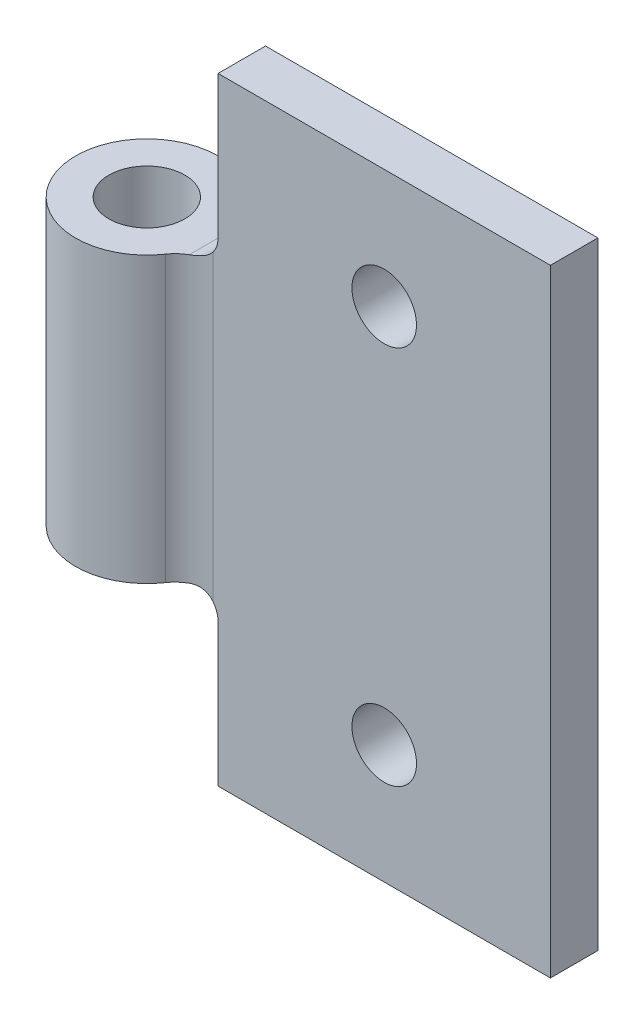
ISO-10303-21;
HEADER;
FILE_DESCRIPTION(('STEP AP214'),'2;1');
FILE_NAME('part.step','',(''),(''),'','','');
FILE_SCHEMA(('AUTOMOTIVE_DESIGN { 1 0 10303 214 1 1 1 1 }'));
ENDSEC;
DATA;
#1=APPLICATION_CONTEXT('core data for automotive mechanical design processes');
#2=APPLICATION_PROTOCOL_DEFINITION('international standard','automotive_design',2000,#1);
#3=PRODUCT_CONTEXT('',#1,'mechanical');
#4=PRODUCT('Part','Part','',(#3));
#5=PRODUCT_RELATED_PRODUCT_CATEGORY('part','',(#4));
#6=PRODUCT_DEFINITION_FORMATION('','',#4);
#7=PRODUCT_DEFINITION_CONTEXT('part definition',#1,'design');
#8=PRODUCT_DEFINITION('design','',#6,#7);
#9=PRODUCT_DEFINITION_SHAPE('','',#8);
#10=(LENGTH_UNIT() NAMED_UNIT(*) SI_UNIT(.MILLI.,.METRE.));
#11=(NAMED_UNIT(*) PLANE_ANGLE_UNIT() SI_UNIT($,.RADIAN.));
#12=(NAMED_UNIT(*) SI_UNIT($,.STERADIAN.) SOLID_ANGLE_UNIT());
#13=UNCERTAINTY_MEASURE_WITH_UNIT(LENGTH_MEASURE(1.E-05),#10,'distance_accuracy_value','');
#14=(GEOMETRIC_REPRESENTATION_CONTEXT(3) GLOBAL_UNCERTAINTY_ASSIGNED_CONTEXT((#13)) GLOBAL_UNIT_ASSIGNED_CONTEXT((#10,
#11,#12)) REPRESENTATION_CONTEXT('',''));
#15=CARTESIAN_POINT('',(0.,0.,0.));
#16=DIRECTION('',(0.,0.,1.));
#17=DIRECTION('',(1.,0.,0.));
#18=AXIS2_PLACEMENT_3D('',#15,#16,#17);
#19=CARTESIAN_POINT('',(-1.5875,31.7373,1.5875));
#20=DIRECTION('',(0.,0.,-1.));
#21=DIRECTION('',(-1.,0.,0.));
#22=AXIS2_PLACEMENT_3D('',#19,#20,#21);
#23=PLANE('',#22);
#24=CARTESIAN_POINT('',(11.1125,7.93749999999999,1.5875));
#25=DIRECTION('',(0.,0.,1.));
#26=DIRECTION('',(1.,0.,0.));
#27=AXIS2_PLACEMENT_3D('',#24,#25,#26);
#28=CIRCLE('',#27,2.15933928990634);
#29=CARTESIAN_POINT('',(13.2718392899063,7.93749999999999,1.5875));
#30=VERTEX_POINT('',#29);
#31=EDGE_CURVE('E268',#30,#30,#28,.T.);
#32=ORIENTED_EDGE('',*,*,#31,.F.);
#33=EDGE_LOOP('',(#32));
#34=FACE_BOUND('',#33,.T.);
#35=CARTESIAN_POINT('',(-1.5875,31.7373,1.5875));
#36=DIRECTION('',(0.,0.,-1.));
#37=DIRECTION('',(-1.,0.,0.));
#38=AXIS2_PLACEMENT_3D('',#35,#36,#37);
#39=CIRCLE('',#38,1.5875);
#40=CARTESIAN_POINT('',(0.,31.7373,1.5875));
#41=VERTEX_POINT('',#40);
#42=CARTESIAN_POINT('',(-0.32586105737924,30.7737526848863,1.5875));
#43=VERTEX_POINT('',#42);
#44=EDGE_CURVE('E278',#41,#43,#39,.T.);
#45=ORIENTED_EDGE('',*,*,#44,.T.);
#46=DIRECTION('',(0.,1.,0.));
#47=VECTOR('',#46,1.);
#48=CARTESIAN_POINT('',(-0.325861057379241,31.7373,1.5875));
#49=LINE('',#48,#47);
#50=CARTESIAN_POINT('',(-0.325861057379229,10.5012473151137,1.5875));
#51=VERTEX_POINT('',#50);
#52=EDGE_CURVE('E168',#43,#51,#49,.F.);
#53=ORIENTED_EDGE('',*,*,#52,.T.);
#54=CARTESIAN_POINT('',(-1.5875,9.5377,1.5875));
#55=DIRECTION('',(0.,0.,-1.));
#56=DIRECTION('',(-1.,0.,0.));
#57=AXIS2_PLACEMENT_3D('',#54,#55,#56);
#58=CIRCLE('',#57,1.5875);
#59=CARTESIAN_POINT('',(0.,9.53769999999999,1.5875));
#60=VERTEX_POINT('',#59);
#61=EDGE_CURVE('E142',#51,#60,#58,.T.);
#62=ORIENTED_EDGE('',*,*,#61,.T.);
#63=DIRECTION('',(0.,-1.,0.));
#64=VECTOR('',#63,1.);
#65=CARTESIAN_POINT('',(0.,9.53769999999999,1.5875));
#66=LINE('',#65,#64);
#67=CARTESIAN_POINT('',(0.,0.,1.5875));
#68=VERTEX_POINT('',#67);
#69=EDGE_CURVE('E135',#60,#68,#66,.T.);
#70=ORIENTED_EDGE('',*,*,#69,.T.);
#71=DIRECTION('',(1.,0.,0.));
#72=VECTOR('',#71,1.);
#73=CARTESIAN_POINT('',(0.,0.,1.5875));
#74=LINE('',#73,#72);
#75=CARTESIAN_POINT('',(22.225,0.,1.5875));
#76=VERTEX_POINT('',#75);
#77=EDGE_CURVE('E124',#68,#76,#74,.T.);
#78=ORIENTED_EDGE('',*,*,#77,.T.);
#79=DIRECTION('',(0.,1.,0.));
#80=VECTOR('',#79,1.);
#81=CARTESIAN_POINT('',(22.225,0.,1.5875));
#82=LINE('',#81,#80);
#83=CARTESIAN_POINT('',(22.225,41.275,1.5875));
#84=VERTEX_POINT('',#83);
#85=EDGE_CURVE('E134',#76,#84,#82,.T.);
#86=ORIENTED_EDGE('',*,*,#85,.T.);
#87=DIRECTION('',(-1.,0.,0.));
#88=VECTOR('',#87,1.);
#89=CARTESIAN_POINT('',(22.225,41.275,1.5875));
#90=LINE('',#89,#88);
#91=CARTESIAN_POINT('',(0.,41.275,1.5875));
#92=VERTEX_POINT('',#91);
#93=EDGE_CURVE('E274',#84,#92,#90,.T.);
#94=ORIENTED_EDGE('',*,*,#93,.T.);
#95=DIRECTION('',(0.,-1.,0.));
#96=VECTOR('',#95,1.);
#97=CARTESIAN_POINT('',(0.,41.275,1.5875));
#98=LINE('',#97,#96);
#99=EDGE_CURVE('E276',#92,#41,#98,.T.);
#100=ORIENTED_EDGE('',*,*,#99,.T.);
#101=EDGE_LOOP('',(#45,#53,#62,#70,#78,#86,#94,#100));
#102=FACE_BOUND('',#101,.T.);
#103=CARTESIAN_POINT('',(11.1125,33.3375,1.5875));
#104=DIRECTION('',(0.,0.,1.));
#105=DIRECTION('',(-1.,0.,0.));
#106=AXIS2_PLACEMENT_3D('',#103,#104,#105);
#107=CIRCLE('',#106,2.15933928990635);
#108=CARTESIAN_POINT('',(8.95316071009365,33.3375,1.5875));
#109=VERTEX_POINT('',#108);
#110=EDGE_CURVE('E262',#109,#109,#107,.T.);
#111=ORIENTED_EDGE('',*,*,#110,.F.);
#112=EDGE_LOOP('',(#111));
#113=FACE_BOUND('',#112,.T.);
#114=ADVANCED_FACE('F31',(#34,#102,#113),#23,.F.);
#115=CARTESIAN_POINT('',(-1.5875,31.7373,-1.5875));
#116=DIRECTION('',(0.,0.,-1.));
#117=DIRECTION('',(-1.,0.,0.));
#118=AXIS2_PLACEMENT_3D('',#115,#116,#117);
#119=PLANE('',#118);
#120=CARTESIAN_POINT('',(-1.5875,9.5377,-1.5875));
#121=DIRECTION('',(0.,0.,-1.));
#122=DIRECTION('',(-1.,0.,0.));
#123=AXIS2_PLACEMENT_3D('',#120,#121,#122);
#124=CIRCLE('',#123,1.5875);
#125=CARTESIAN_POINT('',(-0.325861057379229,10.5012473151137,-1.5875));
#126=VERTEX_POINT('',#125);
#127=CARTESIAN_POINT('',(0.,9.53769999999999,-1.5875));
#128=VERTEX_POINT('',#127);
#129=EDGE_CURVE('E146',#126,#128,#124,.T.);
#130=ORIENTED_EDGE('',*,*,#129,.F.);
#131=DIRECTION('',(0.,-1.,0.));
#132=VECTOR('',#131,1.);
#133=CARTESIAN_POINT('',(-0.32586105737924,30.1498,-1.5875));
#134=LINE('',#133,#132);
#135=CARTESIAN_POINT('',(-0.32586105737924,30.7737526848863,-1.5875));
#136=VERTEX_POINT('',#135);
#137=EDGE_CURVE('E166',#126,#136,#134,.F.);
#138=ORIENTED_EDGE('',*,*,#137,.T.);
#139=CARTESIAN_POINT('',(-1.5875,31.7373,-1.5875));
#140=DIRECTION('',(0.,0.,-1.));
#141=DIRECTION('',(-1.,0.,0.));
#142=AXIS2_PLACEMENT_3D('',#139,#140,#141);
#143=CIRCLE('',#142,1.5875);
#144=CARTESIAN_POINT('',(0.,31.7373,-1.5875));
#145=VERTEX_POINT('',#144);
#146=EDGE_CURVE('E291',#145,#136,#143,.T.);
#147=ORIENTED_EDGE('',*,*,#146,.F.);
#148=DIRECTION('',(0.,-1.,0.));
#149=VECTOR('',#148,1.);
#150=CARTESIAN_POINT('',(0.,41.275,-1.5875));
#151=LINE('',#150,#149);
#152=CARTESIAN_POINT('',(0.,41.275,-1.5875));
#153=VERTEX_POINT('',#152);
#154=EDGE_CURVE('E289',#153,#145,#151,.T.);
#155=ORIENTED_EDGE('',*,*,#154,.F.);
#156=DIRECTION('',(-1.,0.,0.));
#157=VECTOR('',#156,1.);
#158=CARTESIAN_POINT('',(22.225,41.275,-1.5875));
#159=LINE('',#158,#157);
#160=CARTESIAN_POINT('',(22.225,41.275,-1.5875));
#161=VERTEX_POINT('',#160);
#162=EDGE_CURVE('E287',#161,#153,#159,.T.);
#163=ORIENTED_EDGE('',*,*,#162,.F.);
#164=DIRECTION('',(0.,1.,0.));
#165=VECTOR('',#164,1.);
#166=CARTESIAN_POINT('',(22.225,0.,-1.5875));
#167=LINE('',#166,#165);
#168=CARTESIAN_POINT('',(22.225,0.,-1.5875));
#169=VERTEX_POINT('',#168);
#170=EDGE_CURVE('E285',#169,#161,#167,.T.);
#171=ORIENTED_EDGE('',*,*,#170,.F.);
#172=DIRECTION('',(1.,0.,0.));
#173=VECTOR('',#172,1.);
#174=CARTESIAN_POINT('',(0.,0.,-1.5875));
#175=LINE('',#174,#173);
#176=CARTESIAN_POINT('',(0.,0.,-1.5875));
#177=VERTEX_POINT('',#176);
#178=EDGE_CURVE('E283',#177,#169,#175,.T.);
#179=ORIENTED_EDGE('',*,*,#178,.F.);
#180=DIRECTION('',(0.,-1.,0.));
#181=VECTOR('',#180,1.);
#182=CARTESIAN_POINT('',(0.,9.53769999999999,-1.5875));
#183=LINE('',#182,#181);
#184=EDGE_CURVE('E150',#128,#177,#183,.T.);
#185=ORIENTED_EDGE('',*,*,#184,.F.);
#186=EDGE_LOOP('',(#130,#138,#147,#155,#163,#171,#179,#185));
#187=FACE_BOUND('',#186,.T.);
#188=CARTESIAN_POINT('',(11.1125,7.93749999999999,-1.5875));
#189=DIRECTION('',(0.,0.,1.));
#190=DIRECTION('',(1.,0.,0.));
#191=AXIS2_PLACEMENT_3D('',#188,#189,#190);
#192=CIRCLE('',#191,2.15933928990634);
#193=CARTESIAN_POINT('',(13.2718392899063,7.93749999999999,-1.5875));
#194=VERTEX_POINT('',#193);
#195=EDGE_CURVE('E265',#194,#194,#192,.T.);
#196=ORIENTED_EDGE('',*,*,#195,.T.);
#197=EDGE_LOOP('',(#196));
#198=FACE_BOUND('',#197,.T.);
#199=CARTESIAN_POINT('',(11.1125,33.3375,-1.5875));
#200=DIRECTION('',(0.,0.,1.));
#201=DIRECTION('',(-1.,0.,0.));
#202=AXIS2_PLACEMENT_3D('',#199,#200,#201);
#203=CIRCLE('',#202,2.15933928990635);
#204=CARTESIAN_POINT('',(8.95316071009365,33.3375,-1.5875));
#205=VERTEX_POINT('',#204);
#206=EDGE_CURVE('E259',#205,#205,#203,.T.);
#207=ORIENTED_EDGE('',*,*,#206,.T.);
#208=EDGE_LOOP('',(#207));
#209=FACE_BOUND('',#208,.T.);
#210=ADVANCED_FACE('F196',(#187,#198,#209),#119,.T.);
#211=CARTESIAN_POINT('',(0.,9.53769999999999,1.5875));
#212=DIRECTION('',(1.,0.,0.));
#213=DIRECTION('',(0.,1.,0.));
#214=AXIS2_PLACEMENT_3D('',#211,#212,#213);
#215=PLANE('',#214);
#216=ORIENTED_EDGE('',*,*,#184,.T.);
#217=DIRECTION('',(0.,0.,-1.));
#218=VECTOR('',#217,1.);
#219=CARTESIAN_POINT('',(0.,0.,1.5875));
#220=LINE('',#219,#218);
#221=EDGE_CURVE('E128',#68,#177,#220,.T.);
#222=ORIENTED_EDGE('',*,*,#221,.F.);
#223=ORIENTED_EDGE('',*,*,#69,.F.);
#224=DIRECTION('',(0.,0.,-1.));
#225=VECTOR('',#224,1.);
#226=CARTESIAN_POINT('',(0.,9.53769999999999,1.5875));
#227=LINE('',#226,#225);
#228=EDGE_CURVE('E281',#60,#128,#227,.T.);
#229=ORIENTED_EDGE('',*,*,#228,.T.);
#230=EDGE_LOOP('',(#216,#222,#223,#229));
#231=FACE_BOUND('',#230,.T.);
#232=ADVANCED_FACE('F148',(#231),#215,.F.);
#233=CARTESIAN_POINT('',(0.,0.,1.5875));
#234=DIRECTION('',(0.,1.,0.));
#235=DIRECTION('',(0.,0.,1.));
#236=AXIS2_PLACEMENT_3D('',#233,#234,#235);
#237=PLANE('',#236);
#238=ORIENTED_EDGE('',*,*,#178,.T.);
#239=DIRECTION('',(0.,0.,-1.));
#240=VECTOR('',#239,1.);
#241=CARTESIAN_POINT('',(22.225,0.,1.5875));
#242=LINE('',#241,#240);
#243=EDGE_CURVE('E131',#76,#169,#242,.T.);
#244=ORIENTED_EDGE('',*,*,#243,.F.);
#245=ORIENTED_EDGE('',*,*,#77,.F.);
#246=ORIENTED_EDGE('',*,*,#221,.T.);
#247=EDGE_LOOP('',(#238,#244,#245,#246));
#248=FACE_BOUND('',#247,.T.);
#249=ADVANCED_FACE('F126',(#248),#237,.F.);
#250=CARTESIAN_POINT('',(22.225,0.,1.5875));
#251=DIRECTION('',(-1.,0.,0.));
#252=DIRECTION('',(0.,0.,1.));
#253=AXIS2_PLACEMENT_3D('',#250,#251,#252);
#254=PLANE('',#253);
#255=ORIENTED_EDGE('',*,*,#170,.T.);
#256=DIRECTION('',(0.,0.,-1.));
#257=VECTOR('',#256,1.);
#258=CARTESIAN_POINT('',(22.225,41.275,1.5875));
#259=LINE('',#258,#257);
#260=EDGE_CURVE('E155',#84,#161,#259,.T.);
#261=ORIENTED_EDGE('',*,*,#260,.F.);
#262=ORIENTED_EDGE('',*,*,#85,.F.);
#263=ORIENTED_EDGE('',*,*,#243,.T.);
#264=EDGE_LOOP('',(#255,#261,#262,#263));
#265=FACE_BOUND('',#264,.T.);
#266=ADVANCED_FACE('F199',(#265),#254,.F.);
#267=CARTESIAN_POINT('',(22.225,41.275,1.5875));
#268=DIRECTION('',(0.,-1.,0.));
#269=DIRECTION('',(0.,0.,-1.));
#270=AXIS2_PLACEMENT_3D('',#267,#268,#269);
#271=PLANE('',#270);
#272=ORIENTED_EDGE('',*,*,#162,.T.);
#273=DIRECTION('',(0.,0.,-1.));
#274=VECTOR('',#273,1.);
#275=CARTESIAN_POINT('',(0.,41.275,1.5875));
#276=LINE('',#275,#274);
#277=EDGE_CURVE('E301',#92,#153,#276,.T.);
#278=ORIENTED_EDGE('',*,*,#277,.F.);
#279=ORIENTED_EDGE('',*,*,#93,.F.);
#280=ORIENTED_EDGE('',*,*,#260,.T.);
#281=EDGE_LOOP('',(#272,#278,#279,#280));
#282=FACE_BOUND('',#281,.T.);
#283=ADVANCED_FACE('F202',(#282),#271,.F.);
#284=CARTESIAN_POINT('',(0.,41.275,1.5875));
#285=DIRECTION('',(1.,0.,0.));
#286=DIRECTION('',(0.,1.,0.));
#287=AXIS2_PLACEMENT_3D('',#284,#285,#286);
#288=PLANE('',#287);
#289=ORIENTED_EDGE('',*,*,#154,.T.);
#290=DIRECTION('',(0.,0.,-1.));
#291=VECTOR('',#290,1.);
#292=CARTESIAN_POINT('',(0.,31.7373,1.5875));
#293=LINE('',#292,#291);
#294=EDGE_CURVE('E298',#41,#145,#293,.T.);
#295=ORIENTED_EDGE('',*,*,#294,.F.);
#296=ORIENTED_EDGE('',*,*,#99,.F.);
#297=ORIENTED_EDGE('',*,*,#277,.T.);
#298=EDGE_LOOP('',(#289,#295,#296,#297));
#299=FACE_BOUND('',#298,.T.);
#300=ADVANCED_FACE('F206',(#299),#288,.F.);
#301=CARTESIAN_POINT('',(-1.5875,31.7373,1.5875));
#302=DIRECTION('',(0.,0.,-1.));
#303=DIRECTION('',(-1.,0.,0.));
#304=AXIS2_PLACEMENT_3D('',#301,#302,#303);
#305=CYLINDRICAL_SURFACE('',#304,1.5875);
#306=ORIENTED_EDGE('',*,*,#146,.T.);
#307=CARTESIAN_POINT('',(-0.325861057379241,30.7737526848863,-1.5875));
#308=CARTESIAN_POINT('',(-0.350852440017176,30.7410299920205,-1.58750178097361));
#309=CARTESIAN_POINT('',(-0.377108387179057,30.7092925959823,-1.5878693737098));
#310=CARTESIAN_POINT('',(-0.431998667374947,30.6479563295817,-1.58956920495339));
#311=CARTESIAN_POINT('',(-0.460633767447448,30.6183581546997,-1.59090175563976));
#312=CARTESIAN_POINT('',(-0.549675686639572,30.5332277856428,-1.59668465251699));
#313=CARTESIAN_POINT('',(-0.613372628119726,30.4811592195779,-1.60291745062643));
#314=CARTESIAN_POINT('',(-0.747618139180753,30.3876787706459,-1.62184020657373));
#315=CARTESIAN_POINT('',(-0.818190543330004,30.3463059166726,-1.63455332361175));
#316=CARTESIAN_POINT('',(-0.963412892616888,30.2753883684632,-1.66769307821942));
#317=CARTESIAN_POINT('',(-1.03806248911955,30.2458426646981,-1.68811905715361));
#318=CARTESIAN_POINT('',(-1.15310297378553,30.2098120625143,-1.7256151363827));
#319=CARTESIAN_POINT('',(-1.19316334628244,30.1990076746284,-1.73977601805001));
#320=CARTESIAN_POINT('',(-1.27318987264885,30.180686068671,-1.77038320978471));
#321=CARTESIAN_POINT('',(-1.31315599149589,30.1731699247268,-1.78683026433755));
#322=CARTESIAN_POINT('',(-1.39272187119098,30.1612788928829,-1.82200527657274));
#323=CARTESIAN_POINT('',(-1.43231967663216,30.1569159840368,-1.84074161952391));
#324=CARTESIAN_POINT('',(-1.51064024643991,30.1511745177515,-1.88031646527296));
#325=CARTESIAN_POINT('',(-1.54936359522852,30.1497939050159,-1.90115350996693));
#326=CARTESIAN_POINT('',(-1.58750000000002,30.1498,-1.92298935623737));
#327=B_SPLINE_CURVE_WITH_KNOTS('',3,(#307,#308,#309,#310,#311,#312,#313,#314,#315,#316,#317,
#318,#319,#320,#321,#322,#323,#324,#325,#326),.UNSPECIFIED.,.F.,.F.,(4,2,2,2,2,2,2,2,2,4),(0.,
0.123457388743192,0.246954735735409,0.493200867995164,0.740333263682594,0.987444560410513,
1.11881390880805,1.25022613790859,1.38213501121677,1.51395294840416),.UNSPECIFIED.);
#328=CARTESIAN_POINT('',(-1.58750000000001,30.1498,-1.92298935623737));
#329=VERTEX_POINT('',#328);
#330=EDGE_CURVE('E178',#136,#329,#327,.T.);
#331=ORIENTED_EDGE('',*,*,#330,.T.);
#332=DIRECTION('',(0.,0.,-1.));
#333=VECTOR('',#332,1.);
#334=CARTESIAN_POINT('',(-1.58750000000001,30.1498,1.5875));
#335=LINE('',#334,#333);
#336=CARTESIAN_POINT('',(-1.58750000000001,30.1498,1.92298935623737));
#337=VERTEX_POINT('',#336);
#338=EDGE_CURVE('E50',#337,#329,#335,.T.);
#339=ORIENTED_EDGE('',*,*,#338,.F.);
#340=CARTESIAN_POINT('',(-1.58750000000001,30.1498,1.92298935623737));
#341=CARTESIAN_POINT('',(-1.55183917808619,30.1497954996679,1.90257289202669));
#342=CARTESIAN_POINT('',(-1.51566755963559,30.1510018260378,1.88302854207427));
#343=CARTESIAN_POINT('',(-1.44254602660921,30.15600782002,1.84577028222349));
#344=CARTESIAN_POINT('',(-1.40559570065709,30.1598088934504,1.82805737058035));
#345=CARTESIAN_POINT('',(-1.33130511220348,30.1701616980659,1.79461817983449));
#346=CARTESIAN_POINT('',(-1.29396625799876,30.1767055735546,1.7788863926009));
#347=CARTESIAN_POINT('',(-1.21913328979423,30.1926548559138,1.74941560030578));
#348=CARTESIAN_POINT('',(-1.18163921018646,30.2020596592146,1.73567617581764));
#349=CARTESIAN_POINT('',(-1.06908623821788,30.2348006811002,1.69737972663789));
#350=CARTESIAN_POINT('',(-0.994223183455657,30.2626285377657,1.67586305845062));
#351=CARTESIAN_POINT('',(-0.848107205228998,30.3301982741445,1.6406298850201));
#352=CARTESIAN_POINT('',(-0.776855387401982,30.3699437771811,1.62691575566288));
#353=CARTESIAN_POINT('',(-0.672499340743414,30.4392850103991,1.61099408803753));
#354=CARTESIAN_POINT('',(-0.637091698832155,30.4649789858267,1.60640261103605));
#355=CARTESIAN_POINT('',(-0.568396665010468,30.5193100067734,1.59887037248937));
#356=CARTESIAN_POINT('',(-0.535109798159898,30.5479477765638,1.59593001833082));
#357=CARTESIAN_POINT('',(-0.470886933589179,30.6080211964205,1.59143843293007));
#358=CARTESIAN_POINT('',(-0.439958161921401,30.6394648523648,1.58989132591193));
#359=CARTESIAN_POINT('',(-0.380816979219808,30.7048181971085,1.58792233882378));
#360=CARTESIAN_POINT('',(-0.352603325562836,30.7387267452118,1.58749994162649));
#361=CARTESIAN_POINT('',(-0.325861057379241,30.7737526848863,1.5875));
#362=B_SPLINE_CURVE_WITH_KNOTS('',3,(#340,#341,#342,#343,#344,#345,#346,#347,#348,#349,#350,
#351,#352,#353,#354,#355,#356,#357,#358,#359,#360,#361),.UNSPECIFIED.,.F.,.F.,(4,2,2,2,2,2,2,2,
2,2,4),(0.,0.123259278640648,0.246585391454469,0.369560672210149,0.492510026854425,
0.73927835591012,0.986121786171151,1.11793090541479,1.249772532056,1.3820031592715,
1.51417297802032),.UNSPECIFIED.);
#363=EDGE_CURVE('E11',#337,#43,#362,.T.);
#364=ORIENTED_EDGE('',*,*,#363,.T.);
#365=ORIENTED_EDGE('',*,*,#44,.F.);
#366=ORIENTED_EDGE('',*,*,#294,.T.);
#367=EDGE_LOOP('',(#306,#331,#339,#364,#365,#366));
#368=FACE_BOUND('',#367,.T.);
#369=ADVANCED_FACE('F209',(#368),#305,.F.);
#370=CARTESIAN_POINT('',(-1.58750000000001,30.1498,1.5875));
#371=DIRECTION('',(0.,-1.,0.));
#372=DIRECTION('',(1.,0.,0.));
#373=AXIS2_PLACEMENT_3D('',#370,#371,#372);
#374=PLANE('',#373);
#375=CARTESIAN_POINT('',(-6.35000000000001,30.1498,0.));
#376=DIRECTION('',(0.,1.,0.));
#377=DIRECTION('',(-1.,0.,0.));
#378=AXIS2_PLACEMENT_3D('',#375,#376,#377);
#379=CIRCLE('',#378,2.54);
#380=CARTESIAN_POINT('',(-8.89000000000001,30.1498,0.));
#381=VERTEX_POINT('',#380);
#382=EDGE_CURVE('E162',#381,#381,#379,.T.);
#383=ORIENTED_EDGE('',*,*,#382,.F.);
#384=EDGE_LOOP('',(#383));
#385=FACE_BOUND('',#384,.T.);
#386=ORIENTED_EDGE('',*,*,#338,.T.);
#387=CARTESIAN_POINT('',(-0.32586105737924,30.1498,-4.1275));
#388=DIRECTION('',(0.,-1.,0.));
#389=DIRECTION('',(1.,0.,0.));
#390=AXIS2_PLACEMENT_3D('',#387,#388,#389);
#391=CIRCLE('',#390,2.54);
#392=CARTESIAN_POINT('',(-2.42121373307342,30.1498,-2.69184782608695));
#393=VERTEX_POINT('',#392);
#394=EDGE_CURVE('E325',#329,#393,#391,.T.);
#395=ORIENTED_EDGE('',*,*,#394,.T.);
#396=CARTESIAN_POINT('',(-6.35000000000001,30.1498,0.));
#397=DIRECTION('',(0.,1.,0.));
#398=DIRECTION('',(-1.,0.,0.));
#399=AXIS2_PLACEMENT_3D('',#396,#397,#398);
#400=CIRCLE('',#399,4.7625);
#401=CARTESIAN_POINT('',(-2.42121373307342,30.1498,2.69184782608695));
#402=VERTEX_POINT('',#401);
#403=EDGE_CURVE('E161',#393,#402,#400,.T.);
#404=ORIENTED_EDGE('',*,*,#403,.T.);
#405=CARTESIAN_POINT('',(-0.32586105737924,30.1498,4.1275));
#406=DIRECTION('',(0.,-1.,0.));
#407=DIRECTION('',(1.,0.,0.));
#408=AXIS2_PLACEMENT_3D('',#405,#406,#407);
#409=CIRCLE('',#408,2.54);
#410=EDGE_CURVE('E44',#402,#337,#409,.T.);
#411=ORIENTED_EDGE('',*,*,#410,.T.);
#412=EDGE_LOOP('',(#386,#395,#404,#411));
#413=FACE_BOUND('',#412,.T.);
#414=ADVANCED_FACE('F214',(#385,#413),#374,.F.);
#415=CARTESIAN_POINT('',(-6.35,11.1252,1.5875));
#416=DIRECTION('',(0.,1.,0.));
#417=DIRECTION('',(0.,0.,1.));
#418=AXIS2_PLACEMENT_3D('',#415,#416,#417);
#419=PLANE('',#418);
#420=CARTESIAN_POINT('',(-6.35,11.1252,0.));
#421=DIRECTION('',(0.,1.,0.));
#422=DIRECTION('',(0.,0.,1.));
#423=AXIS2_PLACEMENT_3D('',#420,#421,#422);
#424=CIRCLE('',#423,2.54);
#425=CARTESIAN_POINT('',(-6.35,11.1252,2.54));
#426=VERTEX_POINT('',#425);
#427=EDGE_CURVE('E159',#426,#426,#424,.T.);
#428=ORIENTED_EDGE('',*,*,#427,.T.);
#429=EDGE_LOOP('',(#428));
#430=FACE_BOUND('',#429,.T.);
#431=DIRECTION('',(0.,0.,-1.));
#432=VECTOR('',#431,1.);
#433=CARTESIAN_POINT('',(-1.58750000000001,11.1252,1.5875));
#434=LINE('',#433,#432);
#435=CARTESIAN_POINT('',(-1.58750000000001,11.1252,1.92298935623737));
#436=VERTEX_POINT('',#435);
#437=CARTESIAN_POINT('',(-1.58750000000001,11.1252,-1.92298935623737));
#438=VERTEX_POINT('',#437);
#439=EDGE_CURVE('E58',#436,#438,#434,.T.);
#440=ORIENTED_EDGE('',*,*,#439,.F.);
#441=CARTESIAN_POINT('',(-0.32586105737923,11.1252,4.1275));
#442=DIRECTION('',(0.,1.,0.));
#443=DIRECTION('',(0.,0.,1.));
#444=AXIS2_PLACEMENT_3D('',#441,#442,#443);
#445=CIRCLE('',#444,2.54);
#446=CARTESIAN_POINT('',(-2.42121373307341,11.1252,2.69184782608696));
#447=VERTEX_POINT('',#446);
#448=EDGE_CURVE('E324',#436,#447,#445,.T.);
#449=ORIENTED_EDGE('',*,*,#448,.T.);
#450=CARTESIAN_POINT('',(-6.35,11.1252,0.));
#451=DIRECTION('',(0.,1.,0.));
#452=DIRECTION('',(-1.,0.,0.));
#453=AXIS2_PLACEMENT_3D('',#450,#451,#452);
#454=CIRCLE('',#453,4.7625);
#455=CARTESIAN_POINT('',(-2.42121373307341,11.1252,-2.69184782608696));
#456=VERTEX_POINT('',#455);
#457=EDGE_CURVE('E256',#456,#447,#454,.T.);
#458=ORIENTED_EDGE('',*,*,#457,.F.);
#459=CARTESIAN_POINT('',(-0.32586105737923,11.1252,-4.1275));
#460=DIRECTION('',(0.,1.,0.));
#461=DIRECTION('',(0.,0.,1.));
#462=AXIS2_PLACEMENT_3D('',#459,#460,#461);
#463=CIRCLE('',#462,2.54);
#464=EDGE_CURVE('E170',#456,#438,#463,.T.);
#465=ORIENTED_EDGE('',*,*,#464,.T.);
#466=EDGE_LOOP('',(#440,#449,#458,#465));
#467=FACE_BOUND('',#466,.T.);
#468=ADVANCED_FACE('F217',(#430,#467),#419,.F.);
#469=CARTESIAN_POINT('',(-1.5875,9.5377,1.5875));
#470=DIRECTION('',(0.,0.,-1.));
#471=DIRECTION('',(-1.,0.,0.));
#472=AXIS2_PLACEMENT_3D('',#469,#470,#471);
#473=CYLINDRICAL_SURFACE('',#472,1.5875);
#474=ORIENTED_EDGE('',*,*,#439,.T.);
#475=CARTESIAN_POINT('',(-1.58750000000001,11.1252,-1.92298935623737));
#476=CARTESIAN_POINT('',(-1.55183917808618,11.1252045003321,-1.90257289202669));
#477=CARTESIAN_POINT('',(-1.51566755963558,11.1239981739622,-1.88302854207427));
#478=CARTESIAN_POINT('',(-1.44254602660921,11.11899217998,-1.8457702822235));
#479=CARTESIAN_POINT('',(-1.40559570065709,11.1151911065496,-1.82805737058035));
#480=CARTESIAN_POINT('',(-1.33130511220347,11.1048383019341,-1.79461817983449));
#481=CARTESIAN_POINT('',(-1.29396625799876,11.0982944264454,-1.7788863926009));
#482=CARTESIAN_POINT('',(-1.21913328979423,11.0823451440862,-1.74941560030578));
#483=CARTESIAN_POINT('',(-1.18163921018646,11.0729403407854,-1.73567617581764));
#484=CARTESIAN_POINT('',(-1.06908623821788,11.0401993188997,-1.69737972663789));
#485=CARTESIAN_POINT('',(-0.994223183455655,11.0123714622343,-1.67586305845063));
#486=CARTESIAN_POINT('',(-0.848107205228994,10.9448017258555,-1.6406298850201));
#487=CARTESIAN_POINT('',(-0.776855387401979,10.9050562228189,-1.62691575566288));
#488=CARTESIAN_POINT('',(-0.67249934074341,10.8357149896009,-1.61099408803753));
#489=CARTESIAN_POINT('',(-0.63709169883215,10.8100210141733,-1.60640261103605));
#490=CARTESIAN_POINT('',(-0.568396665010461,10.7556899932266,-1.59887037248937));
#491=CARTESIAN_POINT('',(-0.535109798159891,10.7270522234362,-1.59593001833082));
#492=CARTESIAN_POINT('',(-0.47088693358917,10.6669788035795,-1.59143843293007));
#493=CARTESIAN_POINT('',(-0.439958161921392,10.6355351476352,-1.58989132591193));
#494=CARTESIAN_POINT('',(-0.380816979219797,10.5701818028915,-1.58792233882378));
#495=CARTESIAN_POINT('',(-0.352603325562825,10.5362732547882,-1.58749994162649));
#496=CARTESIAN_POINT('',(-0.325861057379229,10.5012473151137,-1.5875));
#497=B_SPLINE_CURVE_WITH_KNOTS('',3,(#475,#476,#477,#478,#479,#480,#481,#482,#483,#484,#485,
#486,#487,#488,#489,#490,#491,#492,#493,#494,#495,#496),.UNSPECIFIED.,.F.,.F.,(4,2,2,2,2,2,2,2,
2,2,4),(0.,0.123259278640649,0.24658539145447,0.36956067221015,0.492510026854425,
0.739278355910121,0.986121786171152,1.11793090541479,1.24977253205601,1.38200315927151,
1.51417297802033),.UNSPECIFIED.);
#498=EDGE_CURVE('E172',#438,#126,#497,.T.);
#499=ORIENTED_EDGE('',*,*,#498,.T.);
#500=ORIENTED_EDGE('',*,*,#129,.T.);
#501=ORIENTED_EDGE('',*,*,#228,.F.);
#502=ORIENTED_EDGE('',*,*,#61,.F.);
#503=CARTESIAN_POINT('',(-0.32586105737923,10.5012473151137,1.5875));
#504=CARTESIAN_POINT('',(-0.350852440017164,10.5339700079795,1.58750178097361));
#505=CARTESIAN_POINT('',(-0.377108387179046,10.5657074040177,1.5878693737098));
#506=CARTESIAN_POINT('',(-0.431998667374936,10.6270436704183,1.58956920495339));
#507=CARTESIAN_POINT('',(-0.460633767447437,10.6566418453003,1.59090175563976));
#508=CARTESIAN_POINT('',(-0.54967568663956,10.7417722143572,1.59668465251699));
#509=CARTESIAN_POINT('',(-0.613372628119713,10.7938407804221,1.60291745062643));
#510=CARTESIAN_POINT('',(-0.74761813918074,10.8873212293541,1.62184020657373));
#511=CARTESIAN_POINT('',(-0.818190543329991,10.9286940833274,1.63455332361175));
#512=CARTESIAN_POINT('',(-0.963412892616872,10.9996116315368,1.66769307821942));
#513=CARTESIAN_POINT('',(-1.03806248911953,11.0291573353018,1.6881190571536));
#514=CARTESIAN_POINT('',(-1.15310297378552,11.0651879374857,1.7256151363827));
#515=CARTESIAN_POINT('',(-1.19316334628242,11.0759923253716,1.73977601805001));
#516=CARTESIAN_POINT('',(-1.27318987264884,11.094313931329,1.77038320978471));
#517=CARTESIAN_POINT('',(-1.31315599149588,11.1018300752732,1.78683026433755));
#518=CARTESIAN_POINT('',(-1.39272187119097,11.1137211071171,1.82200527657275));
#519=CARTESIAN_POINT('',(-1.43231967663215,11.1180840159631,1.84074161952391));
#520=CARTESIAN_POINT('',(-1.51064024643991,11.1238254822485,1.88031646527297));
#521=CARTESIAN_POINT('',(-1.54936359522851,11.1252060949841,1.90115350996694));
#522=CARTESIAN_POINT('',(-1.58750000000001,11.1252,1.92298935623737));
#523=B_SPLINE_CURVE_WITH_KNOTS('',3,(#503,#504,#505,#506,#507,#508,#509,#510,#511,#512,#513,
#514,#515,#516,#517,#518,#519,#520,#521,#522),.UNSPECIFIED.,.F.,.F.,(4,2,2,2,2,2,2,2,2,4),(0.,
0.123457388743194,0.24695473573541,0.493200867995164,0.740333263682594,0.987444560410511,
1.11881390880805,1.2502261379086,1.38213501121678,1.51395294840417),.UNSPECIFIED.);
#524=EDGE_CURVE('E322',#51,#436,#523,.T.);
#525=ORIENTED_EDGE('',*,*,#524,.T.);
#526=EDGE_LOOP('',(#474,#499,#500,#501,#502,#525));
#527=FACE_BOUND('',#526,.T.);
#528=ADVANCED_FACE('F183',(#527),#473,.F.);
#529=CARTESIAN_POINT('',(11.1125,7.93749999999999,1.5875));
#530=DIRECTION('',(0.,0.,-1.));
#531=DIRECTION('',(-1.,0.,0.));
#532=AXIS2_PLACEMENT_3D('',#529,#530,#531);
#533=CYLINDRICAL_SURFACE('',#532,2.15933928990634);
#534=ORIENTED_EDGE('',*,*,#31,.T.);
#535=EDGE_LOOP('',(#534));
#536=FACE_BOUND('',#535,.T.);
#537=ORIENTED_EDGE('',*,*,#195,.F.);
#538=EDGE_LOOP('',(#537));
#539=FACE_BOUND('',#538,.T.);
#540=ADVANCED_FACE('F224',(#536,#539),#533,.F.);
#541=CARTESIAN_POINT('',(11.1125,33.3375,1.5875));
#542=DIRECTION('',(0.,0.,-1.));
#543=DIRECTION('',(-1.,0.,0.));
#544=AXIS2_PLACEMENT_3D('',#541,#542,#543);
#545=CYLINDRICAL_SURFACE('',#544,2.15933928990635);
#546=ORIENTED_EDGE('',*,*,#110,.T.);
#547=EDGE_LOOP('',(#546));
#548=FACE_BOUND('',#547,.T.);
#549=ORIENTED_EDGE('',*,*,#206,.F.);
#550=EDGE_LOOP('',(#549));
#551=FACE_BOUND('',#550,.T.);
#552=ADVANCED_FACE('F237',(#548,#551),#545,.F.);
#553=CARTESIAN_POINT('',(-6.35,11.1252,0.));
#554=DIRECTION('',(0.,1.,0.));
#555=DIRECTION('',(-1.,0.,0.));
#556=AXIS2_PLACEMENT_3D('',#553,#554,#555);
#557=CYLINDRICAL_SURFACE('',#556,4.7625);
#558=ORIENTED_EDGE('',*,*,#403,.F.);
#559=DIRECTION('',(0.,1.,0.));
#560=VECTOR('',#559,1.);
#561=CARTESIAN_POINT('',(-2.42121373307341,11.1252,-2.69184782608696));
#562=LINE('',#561,#560);
#563=EDGE_CURVE('E153',#393,#456,#562,.F.);
#564=ORIENTED_EDGE('',*,*,#563,.T.);
#565=ORIENTED_EDGE('',*,*,#457,.T.);
#566=DIRECTION('',(0.,1.,0.));
#567=VECTOR('',#566,1.);
#568=CARTESIAN_POINT('',(-2.42121373307341,11.1252,2.69184782608696));
#569=LINE('',#568,#567);
#570=EDGE_CURVE('E151',#447,#402,#569,.T.);
#571=ORIENTED_EDGE('',*,*,#570,.T.);
#572=EDGE_LOOP('',(#558,#564,#565,#571));
#573=FACE_BOUND('',#572,.T.);
#574=ADVANCED_FACE('F241',(#573),#557,.T.);
#575=CARTESIAN_POINT('',(-6.34999999999999,0.,0.));
#576=DIRECTION('',(0.,1.,0.));
#577=DIRECTION('',(-1.,0.,0.));
#578=AXIS2_PLACEMENT_3D('',#575,#576,#577);
#579=CYLINDRICAL_SURFACE('',#578,2.54);
#580=ORIENTED_EDGE('',*,*,#382,.T.);
#581=EDGE_LOOP('',(#580));
#582=FACE_BOUND('',#581,.T.);
#583=ORIENTED_EDGE('',*,*,#427,.F.);
#584=EDGE_LOOP('',(#583));
#585=FACE_BOUND('',#584,.T.);
#586=ADVANCED_FACE('F191',(#582,#585),#579,.F.);
#587=CARTESIAN_POINT('',(-0.32586105737923,11.1252,-4.1275));
#588=DIRECTION('',(0.,1.,0.));
#589=DIRECTION('',(-1.,0.,0.));
#590=AXIS2_PLACEMENT_3D('',#587,#588,#589);
#591=CYLINDRICAL_SURFACE('',#590,2.54);
#592=ORIENTED_EDGE('',*,*,#330,.F.);
#593=ORIENTED_EDGE('',*,*,#137,.F.);
#594=ORIENTED_EDGE('',*,*,#498,.F.);
#595=ORIENTED_EDGE('',*,*,#464,.F.);
#596=ORIENTED_EDGE('',*,*,#563,.F.);
#597=ORIENTED_EDGE('',*,*,#394,.F.);
#598=EDGE_LOOP('',(#592,#593,#594,#595,#596,#597));
#599=FACE_BOUND('',#598,.T.);
#600=ADVANCED_FACE('F187',(#599),#591,.F.);
#601=CARTESIAN_POINT('',(-0.32586105737923,11.1252,4.1275));
#602=DIRECTION('',(0.,1.,0.));
#603=DIRECTION('',(-1.,0.,0.));
#604=AXIS2_PLACEMENT_3D('',#601,#602,#603);
#605=CYLINDRICAL_SURFACE('',#604,2.54);
#606=ORIENTED_EDGE('',*,*,#410,.F.);
#607=ORIENTED_EDGE('',*,*,#570,.F.);
#608=ORIENTED_EDGE('',*,*,#448,.F.);
#609=ORIENTED_EDGE('',*,*,#524,.F.);
#610=ORIENTED_EDGE('',*,*,#52,.F.);
#611=ORIENTED_EDGE('',*,*,#363,.F.);
#612=EDGE_LOOP('',(#606,#607,#608,#609,#610,#611));
#613=FACE_BOUND('',#612,.T.);
#614=ADVANCED_FACE('F33',(#613),#605,.F.);
#615=CLOSED_SHELL('',(#114,#210,#232,#249,#266,#283,#300,#369,#414,#468,#528,#540,#552,#574,
#586,#600,#614));
#616=MANIFOLD_SOLID_BREP('B2',#615);
#617=ADVANCED_BREP_SHAPE_REPRESENTATION('',(#18,#616),#14);
#618=SHAPE_DEFINITION_REPRESENTATION(#9,#617);
ENDSEC;
END-ISO-10303-21;
